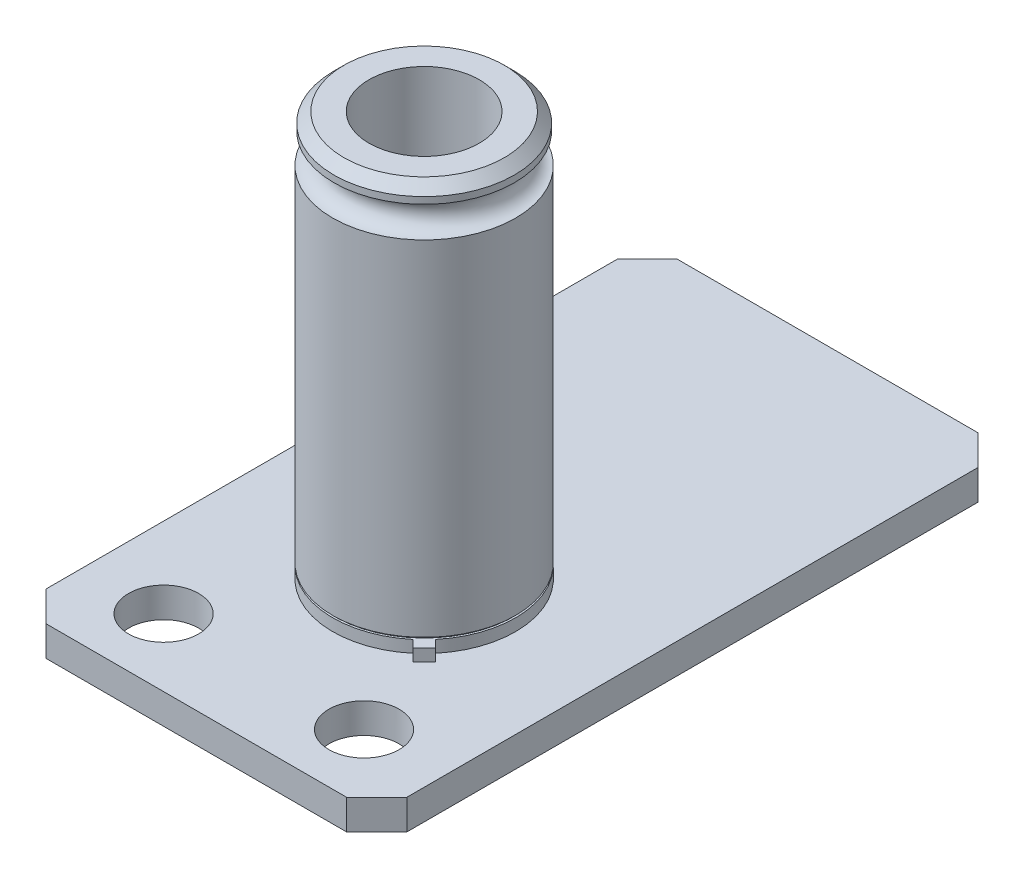
ISO-10303-21;
HEADER;
FILE_DESCRIPTION(('STEP AP214'),'2;1');
FILE_NAME('part.step','',(''),(''),'','','');
FILE_SCHEMA(('AUTOMOTIVE_DESIGN { 1 0 10303 214 1 1 1 1 }'));
ENDSEC;
DATA;
#1=APPLICATION_CONTEXT('core data for automotive mechanical design processes');
#2=APPLICATION_PROTOCOL_DEFINITION('international standard','automotive_design',2000,#1);
#3=PRODUCT_CONTEXT('',#1,'mechanical');
#4=PRODUCT('Part','Part','',(#3));
#5=PRODUCT_RELATED_PRODUCT_CATEGORY('part','',(#4));
#6=PRODUCT_DEFINITION_FORMATION('','',#4);
#7=PRODUCT_DEFINITION_CONTEXT('part definition',#1,'design');
#8=PRODUCT_DEFINITION('design','',#6,#7);
#9=PRODUCT_DEFINITION_SHAPE('','',#8);
#10=(LENGTH_UNIT() NAMED_UNIT(*) SI_UNIT(.MILLI.,.METRE.));
#11=(NAMED_UNIT(*) PLANE_ANGLE_UNIT() SI_UNIT($,.RADIAN.));
#12=(NAMED_UNIT(*) SI_UNIT($,.STERADIAN.) SOLID_ANGLE_UNIT());
#13=UNCERTAINTY_MEASURE_WITH_UNIT(LENGTH_MEASURE(1.E-05),#10,'distance_accuracy_value','');
#14=(GEOMETRIC_REPRESENTATION_CONTEXT(3) GLOBAL_UNCERTAINTY_ASSIGNED_CONTEXT((#13)) GLOBAL_UNIT_ASSIGNED_CONTEXT((#10,
#11,#12)) REPRESENTATION_CONTEXT('',''));
#15=CARTESIAN_POINT('',(0.,0.,0.));
#16=DIRECTION('',(0.,0.,1.));
#17=DIRECTION('',(1.,0.,0.));
#18=AXIS2_PLACEMENT_3D('',#15,#16,#17);
#19=CARTESIAN_POINT('',(-4.46,0.,0.));
#20=DIRECTION('',(0.,1.,0.));
#21=DIRECTION('',(-1.,0.,0.));
#22=AXIS2_PLACEMENT_3D('',#19,#20,#21);
#23=PLANE('',#22);
#24=CARTESIAN_POINT('',(0.,0.,0.));
#25=DIRECTION('',(0.,1.,0.));
#26=DIRECTION('',(-1.,0.,0.));
#27=AXIS2_PLACEMENT_3D('',#24,#25,#26);
#28=CIRCLE('',#27,4.46);
#29=CARTESIAN_POINT('',(-4.46,0.,0.));
#30=VERTEX_POINT('',#29);
#31=EDGE_CURVE('E240',#30,#30,#28,.T.);
#32=ORIENTED_EDGE('',*,*,#31,.T.);
#33=EDGE_LOOP('',(#32));
#34=FACE_BOUND('',#33,.T.);
#35=ADVANCED_FACE('F60',(#34),#23,.T.);
#36=CARTESIAN_POINT('',(0.,0.,0.));
#37=DIRECTION('',(0.,1.,0.));
#38=DIRECTION('',(-1.,0.,0.));
#39=AXIS2_PLACEMENT_3D('',#36,#37,#38);
#40=CYLINDRICAL_SURFACE('',#39,4.56);
#41=DIRECTION('',(0.,1.,0.));
#42=VECTOR('',#41,1.);
#43=CARTESIAN_POINT('',(2.92913487150693,0.,3.49482029645618));
#44=LINE('',#43,#42);
#45=CARTESIAN_POINT('',(2.92913487150693,-0.0999999999999991,3.49482029645618));
#46=VERTEX_POINT('',#45);
#47=CARTESIAN_POINT('',(2.92913487150693,-0.699999999999999,3.49482029645618));
#48=VERTEX_POINT('',#47);
#49=EDGE_CURVE('E237',#46,#48,#44,.F.);
#50=ORIENTED_EDGE('',*,*,#49,.F.);
#51=CARTESIAN_POINT('',(0.,-0.0999999999999995,0.));
#52=DIRECTION('',(0.,1.,0.));
#53=DIRECTION('',(-1.,0.,0.));
#54=AXIS2_PLACEMENT_3D('',#51,#52,#53);
#55=CIRCLE('',#54,4.56);
#56=CARTESIAN_POINT('',(3.49482029645617,-0.099999999999999,2.92913487150694));
#57=VERTEX_POINT('',#56);
#58=EDGE_CURVE('E246',#57,#46,#55,.T.);
#59=ORIENTED_EDGE('',*,*,#58,.F.);
#60=DIRECTION('',(0.,1.,0.));
#61=VECTOR('',#60,1.);
#62=CARTESIAN_POINT('',(3.49482029645617,0.,2.92913487150694));
#63=LINE('',#62,#61);
#64=CARTESIAN_POINT('',(3.49482029645617,-0.699999999999999,2.92913487150694));
#65=VERTEX_POINT('',#64);
#66=EDGE_CURVE('E234',#65,#57,#63,.T.);
#67=ORIENTED_EDGE('',*,*,#66,.F.);
#68=CARTESIAN_POINT('',(0.,-0.699999999999999,0.));
#69=DIRECTION('',(0.,1.,0.));
#70=DIRECTION('',(-1.,0.,0.));
#71=AXIS2_PLACEMENT_3D('',#68,#69,#70);
#72=CIRCLE('',#71,4.56);
#73=EDGE_CURVE('E249',#65,#48,#72,.T.);
#74=ORIENTED_EDGE('',*,*,#73,.T.);
#75=EDGE_LOOP('',(#50,#59,#67,#74));
#76=FACE_BOUND('',#75,.T.);
#77=ADVANCED_FACE('F358',(#76),#40,.T.);
#78=CARTESIAN_POINT('',(-4.56,-0.1,0.));
#79=DIRECTION('',(0.,1.,0.));
#80=DIRECTION('',(-1.,0.,0.));
#81=AXIS2_PLACEMENT_3D('',#78,#79,#80);
#82=PLANE('',#81);
#83=ORIENTED_EDGE('',*,*,#58,.T.);
#84=DIRECTION('',(-0.707106781186546,0.,-0.707106781186549));
#85=VECTOR('',#84,1.);
#86=CARTESIAN_POINT('',(-0.28284271247462,-0.0999999999999994,0.282842712474618));
#87=LINE('',#86,#85);
#88=CARTESIAN_POINT('',(3.2951176003293,-0.099999999999999,3.86080302527856));
#89=VERTEX_POINT('',#88);
#90=EDGE_CURVE('E219',#89,#46,#87,.T.);
#91=ORIENTED_EDGE('',*,*,#90,.F.);
#92=DIRECTION('',(-0.70710678118655,0.,0.707106781186545));
#93=VECTOR('',#92,1.);
#94=CARTESIAN_POINT('',(3.86080302527854,-0.0999999999999994,3.29511760032932));
#95=LINE('',#94,#93);
#96=CARTESIAN_POINT('',(3.86080302527854,-0.099999999999999,3.29511760032932));
#97=VERTEX_POINT('',#96);
#98=EDGE_CURVE('E225',#97,#89,#95,.T.);
#99=ORIENTED_EDGE('',*,*,#98,.F.);
#100=DIRECTION('',(0.707106781186546,0.,0.707106781186549));
#101=VECTOR('',#100,1.);
#102=CARTESIAN_POINT('',(0.28284271247462,-0.0999999999999994,-0.282842712474618));
#103=LINE('',#102,#101);
#104=EDGE_CURVE('E224',#57,#97,#103,.T.);
#105=ORIENTED_EDGE('',*,*,#104,.F.);
#106=EDGE_LOOP('',(#83,#91,#99,#105));
#107=FACE_BOUND('',#106,.T.);
#108=CARTESIAN_POINT('',(0.,-0.0999999999999995,0.));
#109=DIRECTION('',(0.,1.,0.));
#110=DIRECTION('',(-1.,0.,0.));
#111=AXIS2_PLACEMENT_3D('',#108,#109,#110);
#112=CIRCLE('',#111,4.46);
#113=CARTESIAN_POINT('',(-4.46,-0.1,0.));
#114=VERTEX_POINT('',#113);
#115=EDGE_CURVE('E243',#114,#114,#112,.T.);
#116=ORIENTED_EDGE('',*,*,#115,.F.);
#117=EDGE_LOOP('',(#116));
#118=FACE_BOUND('',#117,.T.);
#119=ADVANCED_FACE('F364',(#107,#118),#82,.T.);
#120=CARTESIAN_POINT('',(0.,0.,0.));
#121=DIRECTION('',(0.,1.,0.));
#122=DIRECTION('',(-1.,0.,0.));
#123=AXIS2_PLACEMENT_3D('',#120,#121,#122);
#124=CYLINDRICAL_SURFACE('',#123,4.46);
#125=ORIENTED_EDGE('',*,*,#115,.T.);
#126=EDGE_LOOP('',(#125));
#127=FACE_BOUND('',#126,.T.);
#128=ORIENTED_EDGE('',*,*,#31,.F.);
#129=EDGE_LOOP('',(#128));
#130=FACE_BOUND('',#129,.T.);
#131=ADVANCED_FACE('F368',(#127,#130),#124,.T.);
#132=CARTESIAN_POINT('',(-0.28284271247462,5.76,0.282842712474618));
#133=DIRECTION('',(-0.707106781186549,0.,0.707106781186546));
#134=DIRECTION('',(0.707106781186546,0.,0.707106781186549));
#135=AXIS2_PLACEMENT_3D('',#132,#133,#134);
#136=PLANE('',#135);
#137=ORIENTED_EDGE('',*,*,#90,.T.);
#138=ORIENTED_EDGE('',*,*,#49,.T.);
#139=DIRECTION('',(-0.707106781186546,0.,-0.707106781186549));
#140=VECTOR('',#139,1.);
#141=CARTESIAN_POINT('',(-0.282842712474619,-0.699999999999999,0.282842712474618));
#142=LINE('',#141,#140);
#143=CARTESIAN_POINT('',(3.2951176003293,-0.699999999999999,3.86080302527856));
#144=VERTEX_POINT('',#143);
#145=EDGE_CURVE('E215',#144,#48,#142,.T.);
#146=ORIENTED_EDGE('',*,*,#145,.F.);
#147=DIRECTION('',(0.,-1.,0.));
#148=VECTOR('',#147,1.);
#149=CARTESIAN_POINT('',(3.2951176003293,5.76,3.86080302527856));
#150=LINE('',#149,#148);
#151=EDGE_CURVE('E228',#89,#144,#150,.T.);
#152=ORIENTED_EDGE('',*,*,#151,.F.);
#153=EDGE_LOOP('',(#137,#138,#146,#152));
#154=FACE_BOUND('',#153,.T.);
#155=ADVANCED_FACE('F370',(#154),#136,.T.);
#156=CARTESIAN_POINT('',(0.282842712474619,5.76,-0.282842712474618));
#157=DIRECTION('',(0.707106781186549,0.,-0.707106781186546));
#158=DIRECTION('',(-0.707106781186546,0.,-0.707106781186549));
#159=AXIS2_PLACEMENT_3D('',#156,#157,#158);
#160=PLANE('',#159);
#161=DIRECTION('',(0.707106781186546,0.,0.707106781186549));
#162=VECTOR('',#161,1.);
#163=CARTESIAN_POINT('',(0.28284271247462,-0.699999999999999,-0.282842712474618));
#164=LINE('',#163,#162);
#165=CARTESIAN_POINT('',(3.86080302527854,-0.699999999999999,3.29511760032932));
#166=VERTEX_POINT('',#165);
#167=EDGE_CURVE('E216',#65,#166,#164,.T.);
#168=ORIENTED_EDGE('',*,*,#167,.F.);
#169=ORIENTED_EDGE('',*,*,#66,.T.);
#170=ORIENTED_EDGE('',*,*,#104,.T.);
#171=DIRECTION('',(0.,-1.,0.));
#172=VECTOR('',#171,1.);
#173=CARTESIAN_POINT('',(3.86080302527854,5.76,3.29511760032932));
#174=LINE('',#173,#172);
#175=EDGE_CURVE('E229',#97,#166,#174,.T.);
#176=ORIENTED_EDGE('',*,*,#175,.T.);
#177=EDGE_LOOP('',(#168,#169,#170,#176));
#178=FACE_BOUND('',#177,.T.);
#179=ADVANCED_FACE('F378',(#178),#160,.T.);
#180=CARTESIAN_POINT('',(3.86080302527854,5.76,3.29511760032932));
#181=DIRECTION('',(0.707106781186545,0.,0.70710678118655));
#182=DIRECTION('',(0.70710678118655,0.,-0.707106781186545));
#183=AXIS2_PLACEMENT_3D('',#180,#181,#182);
#184=PLANE('',#183);
#185=ORIENTED_EDGE('',*,*,#175,.F.);
#186=ORIENTED_EDGE('',*,*,#98,.T.);
#187=ORIENTED_EDGE('',*,*,#151,.T.);
#188=DIRECTION('',(-0.70710678118655,0.,0.707106781186545));
#189=VECTOR('',#188,1.);
#190=CARTESIAN_POINT('',(3.86080302527854,-0.699999999999999,3.29511760032932));
#191=LINE('',#190,#189);
#192=EDGE_CURVE('E212',#166,#144,#191,.T.);
#193=ORIENTED_EDGE('',*,*,#192,.F.);
#194=EDGE_LOOP('',(#185,#186,#187,#193));
#195=FACE_BOUND('',#194,.T.);
#196=ADVANCED_FACE('F386',(#195),#184,.T.);
#197=CARTESIAN_POINT('',(9.,-2.2,11.3671159111135));
#198=DIRECTION('',(0.,0.,-1.));
#199=DIRECTION('',(-1.,0.,0.));
#200=AXIS2_PLACEMENT_3D('',#197,#198,#199);
#201=PLANE('',#200);
#202=DIRECTION('',(-1.,0.,0.));
#203=VECTOR('',#202,1.);
#204=CARTESIAN_POINT('',(9.,-2.2,11.3671159111135));
#205=LINE('',#204,#203);
#206=CARTESIAN_POINT('',(7.50000000000001,-2.2,11.3671159111135));
#207=VERTEX_POINT('',#206);
#208=CARTESIAN_POINT('',(-7.5,-2.2,11.3671159111135));
#209=VERTEX_POINT('',#208);
#210=EDGE_CURVE('E187',#207,#209,#205,.T.);
#211=ORIENTED_EDGE('',*,*,#210,.F.);
#212=DIRECTION('',(0.,1.,0.));
#213=VECTOR('',#212,1.);
#214=CARTESIAN_POINT('',(7.50000000000001,-14.2,11.3671159111135));
#215=LINE('',#214,#213);
#216=CARTESIAN_POINT('',(7.50000000000001,-0.699999999999998,11.3671159111135));
#217=VERTEX_POINT('',#216);
#218=EDGE_CURVE('E74',#207,#217,#215,.T.);
#219=ORIENTED_EDGE('',*,*,#218,.T.);
#220=DIRECTION('',(-1.,0.,0.));
#221=VECTOR('',#220,1.);
#222=CARTESIAN_POINT('',(9.,-0.699999999999998,11.3671159111135));
#223=LINE('',#222,#221);
#224=CARTESIAN_POINT('',(-7.5,-0.7,11.3671159111135));
#225=VERTEX_POINT('',#224);
#226=EDGE_CURVE('E163',#217,#225,#223,.T.);
#227=ORIENTED_EDGE('',*,*,#226,.T.);
#228=DIRECTION('',(0.,1.,0.));
#229=VECTOR('',#228,1.);
#230=CARTESIAN_POINT('',(-7.5,-14.2,11.3671159111135));
#231=LINE('',#230,#229);
#232=EDGE_CURVE('E322',#209,#225,#231,.T.);
#233=ORIENTED_EDGE('',*,*,#232,.F.);
#234=EDGE_LOOP('',(#211,#219,#227,#233));
#235=FACE_BOUND('',#234,.T.);
#236=ADVANCED_FACE('F338',(#235),#201,.F.);
#237=CARTESIAN_POINT('',(9.,-2.2,-11.3671159111135));
#238=DIRECTION('',(-1.,0.,0.));
#239=DIRECTION('',(0.,0.,1.));
#240=AXIS2_PLACEMENT_3D('',#237,#238,#239);
#241=PLANE('',#240);
#242=DIRECTION('',(0.,0.,1.));
#243=VECTOR('',#242,1.);
#244=CARTESIAN_POINT('',(9.,-0.699999999999998,-11.3671159111135));
#245=LINE('',#244,#243);
#246=CARTESIAN_POINT('',(9.00000000000001,-0.699999999999998,-18.6328840888865));
#247=VERTEX_POINT('',#246);
#248=CARTESIAN_POINT('',(9.00000000000001,-0.699999999999998,9.86711591111348));
#249=VERTEX_POINT('',#248);
#250=EDGE_CURVE('E161',#247,#249,#245,.T.);
#251=ORIENTED_EDGE('',*,*,#250,.T.);
#252=DIRECTION('',(0.,1.,0.));
#253=VECTOR('',#252,1.);
#254=CARTESIAN_POINT('',(9.00000000000001,-14.2,9.86711591111348));
#255=LINE('',#254,#253);
#256=CARTESIAN_POINT('',(9.00000000000001,-2.2,9.86711591111348));
#257=VERTEX_POINT('',#256);
#258=EDGE_CURVE('E146',#257,#249,#255,.T.);
#259=ORIENTED_EDGE('',*,*,#258,.F.);
#260=DIRECTION('',(0.,0.,1.));
#261=VECTOR('',#260,1.);
#262=CARTESIAN_POINT('',(9.,-2.2,-11.3671159111135));
#263=LINE('',#262,#261);
#264=CARTESIAN_POINT('',(9.,-2.2,-18.6328840888865));
#265=VERTEX_POINT('',#264);
#266=EDGE_CURVE('E296',#265,#257,#263,.T.);
#267=ORIENTED_EDGE('',*,*,#266,.F.);
#268=DIRECTION('',(0.,1.,0.));
#269=VECTOR('',#268,1.);
#270=CARTESIAN_POINT('',(9.00000000000001,-14.2,-18.6328840888865));
#271=LINE('',#270,#269);
#272=EDGE_CURVE('E82',#265,#247,#271,.T.);
#273=ORIENTED_EDGE('',*,*,#272,.T.);
#274=EDGE_LOOP('',(#251,#259,#267,#273));
#275=FACE_BOUND('',#274,.T.);
#276=ADVANCED_FACE('F165',(#275),#241,.F.);
#277=CARTESIAN_POINT('',(-9.,-2.2,-20.1328840888865));
#278=DIRECTION('',(0.,0.,1.));
#279=DIRECTION('',(1.,0.,0.));
#280=AXIS2_PLACEMENT_3D('',#277,#278,#279);
#281=PLANE('',#280);
#282=DIRECTION('',(1.,0.,0.));
#283=VECTOR('',#282,1.);
#284=CARTESIAN_POINT('',(-9.,-0.7,-20.1328840888865));
#285=LINE('',#284,#283);
#286=CARTESIAN_POINT('',(-7.5,-0.7,-20.1328840888865));
#287=VERTEX_POINT('',#286);
#288=CARTESIAN_POINT('',(7.50000000000001,-0.699999999999998,-20.1328840888865));
#289=VERTEX_POINT('',#288);
#290=EDGE_CURVE('E166',#287,#289,#285,.T.);
#291=ORIENTED_EDGE('',*,*,#290,.T.);
#292=DIRECTION('',(0.,1.,0.));
#293=VECTOR('',#292,1.);
#294=CARTESIAN_POINT('',(7.50000000000001,-14.2,-20.1328840888865));
#295=LINE('',#294,#293);
#296=CARTESIAN_POINT('',(7.50000000000001,-2.2,-20.1328840888865));
#297=VERTEX_POINT('',#296);
#298=EDGE_CURVE('E281',#297,#289,#295,.T.);
#299=ORIENTED_EDGE('',*,*,#298,.F.);
#300=DIRECTION('',(1.,0.,0.));
#301=VECTOR('',#300,1.);
#302=CARTESIAN_POINT('',(-9.,-2.2,-20.1328840888865));
#303=LINE('',#302,#301);
#304=CARTESIAN_POINT('',(-7.5,-2.2,-20.1328840888865));
#305=VERTEX_POINT('',#304);
#306=EDGE_CURVE('E288',#305,#297,#303,.T.);
#307=ORIENTED_EDGE('',*,*,#306,.F.);
#308=DIRECTION('',(0.,1.,0.));
#309=VECTOR('',#308,1.);
#310=CARTESIAN_POINT('',(-7.5,-14.2,-20.1328840888865));
#311=LINE('',#310,#309);
#312=EDGE_CURVE('E330',#305,#287,#311,.T.);
#313=ORIENTED_EDGE('',*,*,#312,.T.);
#314=EDGE_LOOP('',(#291,#299,#307,#313));
#315=FACE_BOUND('',#314,.T.);
#316=ADVANCED_FACE('F286',(#315),#281,.F.);
#317=CARTESIAN_POINT('',(0.,-0.699999999999999,0.));
#318=DIRECTION('',(0.,-1.,0.));
#319=DIRECTION('',(1.,0.,0.));
#320=AXIS2_PLACEMENT_3D('',#317,#318,#319);
#321=PLANE('',#320);
#322=CARTESIAN_POINT('',(5.,-0.699999999999999,8.));
#323=DIRECTION('',(0.,1.,0.));
#324=DIRECTION('',(-1.,0.,0.));
#325=AXIS2_PLACEMENT_3D('',#322,#323,#324);
#326=CIRCLE('',#325,1.75);
#327=CARTESIAN_POINT('',(3.25,-0.699999999999999,8.));
#328=VERTEX_POINT('',#327);
#329=EDGE_CURVE('E275',#328,#328,#326,.T.);
#330=ORIENTED_EDGE('',*,*,#329,.F.);
#331=EDGE_LOOP('',(#330));
#332=FACE_BOUND('',#331,.T.);
#333=CARTESIAN_POINT('',(-5.,-0.7,8.));
#334=DIRECTION('',(0.,1.,0.));
#335=DIRECTION('',(-1.,0.,0.));
#336=AXIS2_PLACEMENT_3D('',#333,#334,#335);
#337=CIRCLE('',#336,1.75);
#338=CARTESIAN_POINT('',(-6.75,-0.7,8.));
#339=VERTEX_POINT('',#338);
#340=EDGE_CURVE('E271',#339,#339,#337,.T.);
#341=ORIENTED_EDGE('',*,*,#340,.F.);
#342=EDGE_LOOP('',(#341));
#343=FACE_BOUND('',#342,.T.);
#344=ORIENTED_EDGE('',*,*,#226,.F.);
#345=DIRECTION('',(-0.707106781186548,0.,0.707106781186548));
#346=VECTOR('',#345,1.);
#347=CARTESIAN_POINT('',(9.00000000000001,-0.699999999999998,9.86711591111348));
#348=LINE('',#347,#346);
#349=EDGE_CURVE('E149',#249,#217,#348,.T.);
#350=ORIENTED_EDGE('',*,*,#349,.F.);
#351=ORIENTED_EDGE('',*,*,#250,.F.);
#352=DIRECTION('',(0.707106781186546,0.,0.707106781186549));
#353=VECTOR('',#352,1.);
#354=CARTESIAN_POINT('',(9.00000000000001,-0.699999999999998,-18.6328840888865));
#355=LINE('',#354,#353);
#356=EDGE_CURVE('E290',#289,#247,#355,.T.);
#357=ORIENTED_EDGE('',*,*,#356,.F.);
#358=ORIENTED_EDGE('',*,*,#290,.F.);
#359=DIRECTION('',(0.707106781186548,0.,-0.707106781186547));
#360=VECTOR('',#359,1.);
#361=CARTESIAN_POINT('',(-9.,-0.7,-18.6328840888865));
#362=LINE('',#361,#360);
#363=CARTESIAN_POINT('',(-9.,-0.7,-18.6328840888865));
#364=VERTEX_POINT('',#363);
#365=EDGE_CURVE('E331',#364,#287,#362,.T.);
#366=ORIENTED_EDGE('',*,*,#365,.F.);
#367=DIRECTION('',(0.,0.,-1.));
#368=VECTOR('',#367,1.);
#369=CARTESIAN_POINT('',(-9.,-0.7,-14.7227108509228));
#370=LINE('',#369,#368);
#371=CARTESIAN_POINT('',(-9.,-0.7,9.86711591111348));
#372=VERTEX_POINT('',#371);
#373=EDGE_CURVE('E171',#372,#364,#370,.T.);
#374=ORIENTED_EDGE('',*,*,#373,.F.);
#375=DIRECTION('',(-0.707106781186548,0.,-0.707106781186548));
#376=VECTOR('',#375,1.);
#377=CARTESIAN_POINT('',(-9.,-0.7,9.86711591111348));
#378=LINE('',#377,#376);
#379=EDGE_CURVE('E325',#225,#372,#378,.T.);
#380=ORIENTED_EDGE('',*,*,#379,.F.);
#381=EDGE_LOOP('',(#344,#350,#351,#357,#358,#366,#374,#380));
#382=FACE_BOUND('',#381,.T.);
#383=ORIENTED_EDGE('',*,*,#73,.F.);
#384=ORIENTED_EDGE('',*,*,#167,.T.);
#385=ORIENTED_EDGE('',*,*,#192,.T.);
#386=ORIENTED_EDGE('',*,*,#145,.T.);
#387=EDGE_LOOP('',(#383,#384,#385,#386));
#388=FACE_BOUND('',#387,.T.);
#389=ADVANCED_FACE('F158',(#332,#343,#382,#388),#321,.F.);
#390=CARTESIAN_POINT('',(-9.,-2.2,-14.7227108509228));
#391=DIRECTION('',(1.,0.,0.));
#392=DIRECTION('',(0.,0.,-1.));
#393=AXIS2_PLACEMENT_3D('',#390,#391,#392);
#394=PLANE('',#393);
#395=ORIENTED_EDGE('',*,*,#373,.T.);
#396=DIRECTION('',(0.,1.,0.));
#397=VECTOR('',#396,1.);
#398=CARTESIAN_POINT('',(-9.,-14.2,-18.6328840888865));
#399=LINE('',#398,#397);
#400=CARTESIAN_POINT('',(-9.,-2.2,-18.6328840888865));
#401=VERTEX_POINT('',#400);
#402=EDGE_CURVE('E328',#401,#364,#399,.T.);
#403=ORIENTED_EDGE('',*,*,#402,.F.);
#404=DIRECTION('',(0.,0.,-1.));
#405=VECTOR('',#404,1.);
#406=CARTESIAN_POINT('',(-9.,-2.2,-14.7227108509228));
#407=LINE('',#406,#405);
#408=CARTESIAN_POINT('',(-9.00000000000001,-2.2,9.86711591111347));
#409=VERTEX_POINT('',#408);
#410=EDGE_CURVE('E168',#409,#401,#407,.T.);
#411=ORIENTED_EDGE('',*,*,#410,.F.);
#412=DIRECTION('',(0.,1.,0.));
#413=VECTOR('',#412,1.);
#414=CARTESIAN_POINT('',(-9.,-14.2,9.86711591111348));
#415=LINE('',#414,#413);
#416=EDGE_CURVE('E321',#409,#372,#415,.T.);
#417=ORIENTED_EDGE('',*,*,#416,.T.);
#418=EDGE_LOOP('',(#395,#403,#411,#417));
#419=FACE_BOUND('',#418,.T.);
#420=ADVANCED_FACE('F344',(#419),#394,.F.);
#421=CARTESIAN_POINT('',(0.,-2.2,0.));
#422=DIRECTION('',(0.,-1.,0.));
#423=DIRECTION('',(1.,0.,0.));
#424=AXIS2_PLACEMENT_3D('',#421,#422,#423);
#425=PLANE('',#424);
#426=DIRECTION('',(0.707106781186548,0.,-0.707106781186548));
#427=VECTOR('',#426,1.);
#428=CARTESIAN_POINT('',(9.43355795555674,-2.2,9.43355795555674));
#429=LINE('',#428,#427);
#430=EDGE_CURVE('E14',#207,#257,#429,.T.);
#431=ORIENTED_EDGE('',*,*,#430,.F.);
#432=ORIENTED_EDGE('',*,*,#210,.T.);
#433=DIRECTION('',(0.707106781186548,0.,0.707106781186548));
#434=VECTOR('',#433,1.);
#435=CARTESIAN_POINT('',(-9.43355795555674,-2.2,9.43355795555674));
#436=LINE('',#435,#434);
#437=EDGE_CURVE('E182',#409,#209,#436,.T.);
#438=ORIENTED_EDGE('',*,*,#437,.F.);
#439=ORIENTED_EDGE('',*,*,#410,.T.);
#440=DIRECTION('',(-0.707106781186548,0.,0.707106781186547));
#441=VECTOR('',#440,1.);
#442=CARTESIAN_POINT('',(-13.8164420444433,-2.2,-13.8164420444433));
#443=LINE('',#442,#441);
#444=EDGE_CURVE('E278',#305,#401,#443,.T.);
#445=ORIENTED_EDGE('',*,*,#444,.F.);
#446=ORIENTED_EDGE('',*,*,#306,.T.);
#447=DIRECTION('',(-0.707106781186546,0.,-0.707106781186549));
#448=VECTOR('',#447,1.);
#449=CARTESIAN_POINT('',(13.8164420444433,-2.2,-13.8164420444432));
#450=LINE('',#449,#448);
#451=EDGE_CURVE('E68',#265,#297,#450,.T.);
#452=ORIENTED_EDGE('',*,*,#451,.F.);
#453=ORIENTED_EDGE('',*,*,#266,.T.);
#454=EDGE_LOOP('',(#431,#432,#438,#439,#445,#446,#452,#453));
#455=FACE_BOUND('',#454,.T.);
#456=CARTESIAN_POINT('',(5.,-2.2,8.));
#457=DIRECTION('',(0.,-1.,0.));
#458=DIRECTION('',(1.,0.,0.));
#459=AXIS2_PLACEMENT_3D('',#456,#457,#458);
#460=CIRCLE('',#459,1.75);
#461=CARTESIAN_POINT('',(6.75,-2.2,8.));
#462=VERTEX_POINT('',#461);
#463=EDGE_CURVE('E272',#462,#462,#460,.T.);
#464=ORIENTED_EDGE('',*,*,#463,.F.);
#465=EDGE_LOOP('',(#464));
#466=FACE_BOUND('',#465,.T.);
#467=CARTESIAN_POINT('',(-5.,-2.2,8.));
#468=DIRECTION('',(0.,-1.,0.));
#469=DIRECTION('',(1.,0.,0.));
#470=AXIS2_PLACEMENT_3D('',#467,#468,#469);
#471=CIRCLE('',#470,1.75);
#472=CARTESIAN_POINT('',(-3.25,-2.2,8.));
#473=VERTEX_POINT('',#472);
#474=EDGE_CURVE('E268',#473,#473,#471,.T.);
#475=ORIENTED_EDGE('',*,*,#474,.F.);
#476=EDGE_LOOP('',(#475));
#477=FACE_BOUND('',#476,.T.);
#478=CARTESIAN_POINT('',(0.,-2.2,2.54));
#479=DIRECTION('',(0.,-1.,0.));
#480=DIRECTION('',(1.,0.,0.));
#481=AXIS2_PLACEMENT_3D('',#478,#479,#480);
#482=CIRCLE('',#481,0.225);
#483=CARTESIAN_POINT('',(0.225,-2.2,2.54));
#484=VERTEX_POINT('',#483);
#485=EDGE_CURVE('E200',#484,#484,#482,.T.);
#486=ORIENTED_EDGE('',*,*,#485,.F.);
#487=EDGE_LOOP('',(#486));
#488=FACE_BOUND('',#487,.T.);
#489=CARTESIAN_POINT('',(2.54,-2.2,0.));
#490=DIRECTION('',(0.,-1.,0.));
#491=DIRECTION('',(1.,0.,0.));
#492=AXIS2_PLACEMENT_3D('',#489,#490,#491);
#493=CIRCLE('',#492,0.225);
#494=CARTESIAN_POINT('',(2.765,-2.2,0.));
#495=VERTEX_POINT('',#494);
#496=EDGE_CURVE('E197',#495,#495,#493,.T.);
#497=ORIENTED_EDGE('',*,*,#496,.F.);
#498=EDGE_LOOP('',(#497));
#499=FACE_BOUND('',#498,.T.);
#500=CARTESIAN_POINT('',(0.,-2.2,-2.54));
#501=DIRECTION('',(0.,-1.,0.));
#502=DIRECTION('',(1.,0.,0.));
#503=AXIS2_PLACEMENT_3D('',#500,#501,#502);
#504=CIRCLE('',#503,0.225);
#505=CARTESIAN_POINT('',(0.225,-2.2,-2.54));
#506=VERTEX_POINT('',#505);
#507=EDGE_CURVE('E194',#506,#506,#504,.T.);
#508=ORIENTED_EDGE('',*,*,#507,.F.);
#509=EDGE_LOOP('',(#508));
#510=FACE_BOUND('',#509,.T.);
#511=CARTESIAN_POINT('',(-2.54,-2.2,0.));
#512=DIRECTION('',(0.,-1.,0.));
#513=DIRECTION('',(1.,0.,0.));
#514=AXIS2_PLACEMENT_3D('',#511,#512,#513);
#515=CIRCLE('',#514,0.225);
#516=CARTESIAN_POINT('',(-2.315,-2.2,0.));
#517=VERTEX_POINT('',#516);
#518=EDGE_CURVE('E193',#517,#517,#515,.T.);
#519=ORIENTED_EDGE('',*,*,#518,.F.);
#520=EDGE_LOOP('',(#519));
#521=FACE_BOUND('',#520,.T.);
#522=ADVANCED_FACE('F293',(#455,#466,#477,#488,#499,#510,#521),#425,.T.);
#523=CARTESIAN_POINT('',(0.,-13.1,-2.54));
#524=DIRECTION('',(0.,1.,0.));
#525=DIRECTION('',(-1.,0.,0.));
#526=AXIS2_PLACEMENT_3D('',#523,#524,#525);
#527=CYLINDRICAL_SURFACE('',#526,0.225);
#528=CARTESIAN_POINT('',(0.,-2.43755455334988,-2.54));
#529=DIRECTION('',(0.,1.,0.));
#530=DIRECTION('',(-1.,0.,0.));
#531=AXIS2_PLACEMENT_3D('',#528,#529,#530);
#532=CIRCLE('',#531,0.225);
#533=CARTESIAN_POINT('',(-0.225,-2.43755455334988,-2.54));
#534=VERTEX_POINT('',#533);
#535=EDGE_CURVE('E303',#534,#534,#532,.T.);
#536=ORIENTED_EDGE('',*,*,#535,.T.);
#537=EDGE_LOOP('',(#536));
#538=FACE_BOUND('',#537,.T.);
#539=ORIENTED_EDGE('',*,*,#507,.T.);
#540=EDGE_LOOP('',(#539));
#541=FACE_BOUND('',#540,.T.);
#542=ADVANCED_FACE('F434',(#538,#541),#527,.T.);
#543=CARTESIAN_POINT('',(2.54,-13.1,0.));
#544=DIRECTION('',(0.,1.,0.));
#545=DIRECTION('',(-1.,0.,0.));
#546=AXIS2_PLACEMENT_3D('',#543,#544,#545);
#547=CYLINDRICAL_SURFACE('',#546,0.225);
#548=CARTESIAN_POINT('',(2.54,-2.43755455334988,0.));
#549=DIRECTION('',(0.,1.,0.));
#550=DIRECTION('',(-1.,0.,0.));
#551=AXIS2_PLACEMENT_3D('',#548,#549,#550);
#552=CIRCLE('',#551,0.225);
#553=CARTESIAN_POINT('',(2.315,-2.43755455334988,0.));
#554=VERTEX_POINT('',#553);
#555=EDGE_CURVE('E309',#554,#554,#552,.T.);
#556=ORIENTED_EDGE('',*,*,#555,.T.);
#557=EDGE_LOOP('',(#556));
#558=FACE_BOUND('',#557,.T.);
#559=ORIENTED_EDGE('',*,*,#496,.T.);
#560=EDGE_LOOP('',(#559));
#561=FACE_BOUND('',#560,.T.);
#562=ADVANCED_FACE('F430',(#558,#561),#547,.T.);
#563=CARTESIAN_POINT('',(0.,-13.1,2.54));
#564=DIRECTION('',(0.,1.,0.));
#565=DIRECTION('',(-1.,0.,0.));
#566=AXIS2_PLACEMENT_3D('',#563,#564,#565);
#567=CYLINDRICAL_SURFACE('',#566,0.225);
#568=CARTESIAN_POINT('',(0.,-2.43755455334988,2.54));
#569=DIRECTION('',(0.,1.,0.));
#570=DIRECTION('',(-1.,0.,0.));
#571=AXIS2_PLACEMENT_3D('',#568,#569,#570);
#572=CIRCLE('',#571,0.225);
#573=CARTESIAN_POINT('',(-0.225,-2.43755455334988,2.54));
#574=VERTEX_POINT('',#573);
#575=EDGE_CURVE('E267',#574,#574,#572,.T.);
#576=ORIENTED_EDGE('',*,*,#575,.T.);
#577=EDGE_LOOP('',(#576));
#578=FACE_BOUND('',#577,.T.);
#579=ORIENTED_EDGE('',*,*,#485,.T.);
#580=EDGE_LOOP('',(#579));
#581=FACE_BOUND('',#580,.T.);
#582=ADVANCED_FACE('F426',(#578,#581),#567,.T.);
#583=CARTESIAN_POINT('',(-2.54,-13.1,0.));
#584=DIRECTION('',(0.,1.,0.));
#585=DIRECTION('',(-1.,0.,0.));
#586=AXIS2_PLACEMENT_3D('',#583,#584,#585);
#587=CYLINDRICAL_SURFACE('',#586,0.225);
#588=CARTESIAN_POINT('',(-2.54,-2.43755455334988,0.));
#589=DIRECTION('',(0.,1.,0.));
#590=DIRECTION('',(-1.,0.,0.));
#591=AXIS2_PLACEMENT_3D('',#588,#589,#590);
#592=CIRCLE('',#591,0.225);
#593=CARTESIAN_POINT('',(-2.765,-2.43755455334988,0.));
#594=VERTEX_POINT('',#593);
#595=EDGE_CURVE('E264',#594,#594,#592,.T.);
#596=ORIENTED_EDGE('',*,*,#595,.T.);
#597=EDGE_LOOP('',(#596));
#598=FACE_BOUND('',#597,.T.);
#599=ORIENTED_EDGE('',*,*,#518,.T.);
#600=EDGE_LOOP('',(#599));
#601=FACE_BOUND('',#600,.T.);
#602=ADVANCED_FACE('F429',(#598,#601),#587,.T.);
#603=CARTESIAN_POINT('',(4.5,-2.43755455334988,-2.93327593557546));
#604=DIRECTION('',(0.,1.,0.));
#605=DIRECTION('',(-1.,0.,0.));
#606=AXIS2_PLACEMENT_3D('',#603,#604,#605);
#607=PLANE('',#606);
#608=ORIENTED_EDGE('',*,*,#595,.F.);
#609=EDGE_LOOP('',(#608));
#610=FACE_BOUND('',#609,.T.);
#611=ADVANCED_FACE('F440',(#610),#607,.F.);
#612=ORIENTED_EDGE('',*,*,#575,.F.);
#613=EDGE_LOOP('',(#612));
#614=FACE_BOUND('',#613,.T.);
#615=ADVANCED_FACE('F553',(#614),#607,.F.);
#616=ORIENTED_EDGE('',*,*,#555,.F.);
#617=EDGE_LOOP('',(#616));
#618=FACE_BOUND('',#617,.T.);
#619=ADVANCED_FACE('F459',(#618),#607,.F.);
#620=ORIENTED_EDGE('',*,*,#535,.F.);
#621=EDGE_LOOP('',(#620));
#622=FACE_BOUND('',#621,.T.);
#623=ADVANCED_FACE('F455',(#622),#607,.F.);
#624=CARTESIAN_POINT('',(-5.,-14.2,8.));
#625=DIRECTION('',(0.,1.,0.));
#626=DIRECTION('',(-1.,0.,0.));
#627=AXIS2_PLACEMENT_3D('',#624,#625,#626);
#628=CYLINDRICAL_SURFACE('',#627,1.75);
#629=ORIENTED_EDGE('',*,*,#474,.T.);
#630=EDGE_LOOP('',(#629));
#631=FACE_BOUND('',#630,.T.);
#632=ORIENTED_EDGE('',*,*,#340,.T.);
#633=EDGE_LOOP('',(#632));
#634=FACE_BOUND('',#633,.T.);
#635=ADVANCED_FACE('F458',(#631,#634),#628,.F.);
#636=CARTESIAN_POINT('',(5.,-14.2,8.));
#637=DIRECTION('',(0.,1.,0.));
#638=DIRECTION('',(-1.,0.,0.));
#639=AXIS2_PLACEMENT_3D('',#636,#637,#638);
#640=CYLINDRICAL_SURFACE('',#639,1.75);
#641=ORIENTED_EDGE('',*,*,#463,.T.);
#642=EDGE_LOOP('',(#641));
#643=FACE_BOUND('',#642,.T.);
#644=ORIENTED_EDGE('',*,*,#329,.T.);
#645=EDGE_LOOP('',(#644));
#646=FACE_BOUND('',#645,.T.);
#647=ADVANCED_FACE('F355',(#643,#646),#640,.F.);
#648=CARTESIAN_POINT('',(-9.,-14.2,9.86711591111348));
#649=DIRECTION('',(0.707106781186547,0.,-0.707106781186547));
#650=DIRECTION('',(-0.707106781186548,0.,-0.707106781186548));
#651=AXIS2_PLACEMENT_3D('',#648,#649,#650);
#652=PLANE('',#651);
#653=ORIENTED_EDGE('',*,*,#437,.T.);
#654=ORIENTED_EDGE('',*,*,#232,.T.);
#655=ORIENTED_EDGE('',*,*,#379,.T.);
#656=ORIENTED_EDGE('',*,*,#416,.F.);
#657=EDGE_LOOP('',(#653,#654,#655,#656));
#658=FACE_BOUND('',#657,.T.);
#659=ADVANCED_FACE('F343',(#658),#652,.F.);
#660=CARTESIAN_POINT('',(-9.,-14.2,-18.6328840888865));
#661=DIRECTION('',(0.707106781186547,0.,0.707106781186548));
#662=DIRECTION('',(0.707106781186548,0.,-0.707106781186547));
#663=AXIS2_PLACEMENT_3D('',#660,#661,#662);
#664=PLANE('',#663);
#665=ORIENTED_EDGE('',*,*,#444,.T.);
#666=ORIENTED_EDGE('',*,*,#402,.T.);
#667=ORIENTED_EDGE('',*,*,#365,.T.);
#668=ORIENTED_EDGE('',*,*,#312,.F.);
#669=EDGE_LOOP('',(#665,#666,#667,#668));
#670=FACE_BOUND('',#669,.T.);
#671=ADVANCED_FACE('F347',(#670),#664,.F.);
#672=CARTESIAN_POINT('',(9.00000000000001,-14.2,-18.6328840888865));
#673=DIRECTION('',(-0.707106781186549,0.,0.707106781186546));
#674=DIRECTION('',(0.707106781186546,0.,0.707106781186549));
#675=AXIS2_PLACEMENT_3D('',#672,#673,#674);
#676=PLANE('',#675);
#677=ORIENTED_EDGE('',*,*,#451,.T.);
#678=ORIENTED_EDGE('',*,*,#298,.T.);
#679=ORIENTED_EDGE('',*,*,#356,.T.);
#680=ORIENTED_EDGE('',*,*,#272,.F.);
#681=EDGE_LOOP('',(#677,#678,#679,#680));
#682=FACE_BOUND('',#681,.T.);
#683=ADVANCED_FACE('F280',(#682),#676,.F.);
#684=CARTESIAN_POINT('',(9.00000000000001,-14.2,9.86711591111348));
#685=DIRECTION('',(-0.707106781186547,0.,-0.707106781186547));
#686=DIRECTION('',(-0.707106781186548,0.,0.707106781186548));
#687=AXIS2_PLACEMENT_3D('',#684,#685,#686);
#688=PLANE('',#687);
#689=ORIENTED_EDGE('',*,*,#430,.T.);
#690=ORIENTED_EDGE('',*,*,#258,.T.);
#691=ORIENTED_EDGE('',*,*,#349,.T.);
#692=ORIENTED_EDGE('',*,*,#218,.F.);
#693=EDGE_LOOP('',(#689,#690,#691,#692));
#694=FACE_BOUND('',#693,.T.);
#695=ADVANCED_FACE('F148',(#694),#688,.F.);
#696=CLOSED_SHELL('',(#35,#77,#119,#131,#155,#179,#196,#236,#276,#316,#389,#420,#522,#542,#562,
#582,#602,#611,#615,#619,#623,#635,#647,#659,#671,#683,#695));
#697=CARTESIAN_POINT('',(0.,-0.699999999999999,-2.54));
#698=DIRECTION('',(0.,-1.,0.));
#699=DIRECTION('',(1.,0.,0.));
#700=AXIS2_PLACEMENT_3D('',#697,#698,#699);
#701=CIRCLE('',#700,0.8);
#702=CARTESIAN_POINT('',(0.8,-0.699999999999999,-2.54));
#703=VERTEX_POINT('',#702);
#704=EDGE_CURVE('E186',#703,#703,#701,.F.);
#705=ORIENTED_EDGE('',*,*,#704,.T.);
#706=EDGE_LOOP('',(#705));
#707=FACE_BOUND('',#706,.T.);
#708=CARTESIAN_POINT('',(0.,-0.699999999999999,-2.54));
#709=DIRECTION('',(0.,-1.,0.));
#710=DIRECTION('',(1.,0.,0.));
#711=AXIS2_PLACEMENT_3D('',#708,#709,#710);
#712=CIRCLE('',#711,0.225);
#713=CARTESIAN_POINT('',(0.225,-0.699999999999999,-2.54));
#714=VERTEX_POINT('',#713);
#715=EDGE_CURVE('E175',#714,#714,#712,.T.);
#716=ORIENTED_EDGE('',*,*,#715,.T.);
#717=EDGE_LOOP('',(#716));
#718=FACE_BOUND('',#717,.T.);
#719=ADVANCED_FACE('F412',(#707,#718),#321,.F.);
#720=CARTESIAN_POINT('',(0.,2.16274169979695,-2.54));
#721=DIRECTION('',(0.,-1.,0.));
#722=DIRECTION('',(1.,0.,0.));
#723=AXIS2_PLACEMENT_3D('',#720,#721,#722);
#724=CYLINDRICAL_SURFACE('',#723,0.8);
#725=ORIENTED_EDGE('',*,*,#704,.F.);
#726=EDGE_LOOP('',(#725));
#727=FACE_BOUND('',#726,.T.);
#728=CARTESIAN_POINT('',(0.,-0.0999999999999994,-2.54));
#729=DIRECTION('',(0.,1.,0.));
#730=DIRECTION('',(-1.,0.,0.));
#731=AXIS2_PLACEMENT_3D('',#728,#729,#730);
#732=CIRCLE('',#731,0.8);
#733=CARTESIAN_POINT('',(-0.8,-0.0999999999999995,-2.54));
#734=VERTEX_POINT('',#733);
#735=EDGE_CURVE('E206',#734,#734,#732,.F.);
#736=ORIENTED_EDGE('',*,*,#735,.F.);
#737=EDGE_LOOP('',(#736));
#738=FACE_BOUND('',#737,.T.);
#739=ADVANCED_FACE('F407',(#727,#738),#724,.F.);
#740=CARTESIAN_POINT('',(-4.56,-0.1,0.));
#741=DIRECTION('',(0.,1.,0.));
#742=DIRECTION('',(-1.,0.,0.));
#743=AXIS2_PLACEMENT_3D('',#740,#741,#742);
#744=PLANE('',#743);
#745=CARTESIAN_POINT('',(0.,-0.0999999999999994,-2.54));
#746=DIRECTION('',(0.,1.,0.));
#747=DIRECTION('',(-1.,0.,0.));
#748=AXIS2_PLACEMENT_3D('',#745,#746,#747);
#749=CIRCLE('',#748,0.225);
#750=CARTESIAN_POINT('',(-0.225,-0.0999999999999994,-2.54));
#751=VERTEX_POINT('',#750);
#752=EDGE_CURVE('E254',#751,#751,#749,.F.);
#753=ORIENTED_EDGE('',*,*,#752,.F.);
#754=EDGE_LOOP('',(#753));
#755=FACE_BOUND('',#754,.T.);
#756=ORIENTED_EDGE('',*,*,#735,.T.);
#757=EDGE_LOOP('',(#756));
#758=FACE_BOUND('',#757,.T.);
#759=ADVANCED_FACE('F403',(#755,#758),#744,.F.);
#760=ORIENTED_EDGE('',*,*,#752,.T.);
#761=EDGE_LOOP('',(#760));
#762=FACE_BOUND('',#761,.T.);
#763=ORIENTED_EDGE('',*,*,#715,.F.);
#764=EDGE_LOOP('',(#763));
#765=FACE_BOUND('',#764,.T.);
#766=ADVANCED_FACE('F406',(#762,#765),#527,.T.);
#767=CLOSED_SHELL('',(#719,#739,#759,#766));
#768=CARTESIAN_POINT('',(-2.54,-0.7,0.));
#769=DIRECTION('',(0.,-1.,0.));
#770=DIRECTION('',(1.,0.,0.));
#771=AXIS2_PLACEMENT_3D('',#768,#769,#770);
#772=CIRCLE('',#771,0.8);
#773=CARTESIAN_POINT('',(-1.74,-0.7,0.));
#774=VERTEX_POINT('',#773);
#775=EDGE_CURVE('E183',#774,#774,#772,.F.);
#776=ORIENTED_EDGE('',*,*,#775,.T.);
#777=EDGE_LOOP('',(#776));
#778=FACE_BOUND('',#777,.T.);
#779=CARTESIAN_POINT('',(-2.54,-0.699999999999999,0.));
#780=DIRECTION('',(0.,-1.,0.));
#781=DIRECTION('',(1.,0.,0.));
#782=AXIS2_PLACEMENT_3D('',#779,#780,#781);
#783=CIRCLE('',#782,0.225);
#784=CARTESIAN_POINT('',(-2.315,-0.699999999999999,0.));
#785=VERTEX_POINT('',#784);
#786=EDGE_CURVE('E179',#785,#785,#783,.T.);
#787=ORIENTED_EDGE('',*,*,#786,.T.);
#788=EDGE_LOOP('',(#787));
#789=FACE_BOUND('',#788,.T.);
#790=ADVANCED_FACE('F424',(#778,#789),#321,.F.);
#791=CARTESIAN_POINT('',(-2.54,2.16274169979695,0.));
#792=DIRECTION('',(0.,-1.,0.));
#793=DIRECTION('',(1.,0.,0.));
#794=AXIS2_PLACEMENT_3D('',#791,#792,#793);
#795=CYLINDRICAL_SURFACE('',#794,0.8);
#796=ORIENTED_EDGE('',*,*,#775,.F.);
#797=EDGE_LOOP('',(#796));
#798=FACE_BOUND('',#797,.T.);
#799=CARTESIAN_POINT('',(-2.54,-0.0999999999999994,0.));
#800=DIRECTION('',(0.,1.,0.));
#801=DIRECTION('',(-1.,0.,0.));
#802=AXIS2_PLACEMENT_3D('',#799,#800,#801);
#803=CIRCLE('',#802,0.8);
#804=CARTESIAN_POINT('',(-3.34,-0.0999999999999995,0.));
#805=VERTEX_POINT('',#804);
#806=EDGE_CURVE('E203',#805,#805,#803,.F.);
#807=ORIENTED_EDGE('',*,*,#806,.F.);
#808=EDGE_LOOP('',(#807));
#809=FACE_BOUND('',#808,.T.);
#810=ADVANCED_FACE('F418',(#798,#809),#795,.F.);
#811=CARTESIAN_POINT('',(-4.56,-0.1,0.));
#812=DIRECTION('',(0.,1.,0.));
#813=DIRECTION('',(-1.,0.,0.));
#814=AXIS2_PLACEMENT_3D('',#811,#812,#813);
#815=PLANE('',#814);
#816=CARTESIAN_POINT('',(-2.54,-0.0999999999999994,0.));
#817=DIRECTION('',(0.,1.,0.));
#818=DIRECTION('',(-1.,0.,0.));
#819=AXIS2_PLACEMENT_3D('',#816,#817,#818);
#820=CIRCLE('',#819,0.225);
#821=CARTESIAN_POINT('',(-2.765,-0.0999999999999994,0.));
#822=VERTEX_POINT('',#821);
#823=EDGE_CURVE('E257',#822,#822,#820,.F.);
#824=ORIENTED_EDGE('',*,*,#823,.F.);
#825=EDGE_LOOP('',(#824));
#826=FACE_BOUND('',#825,.T.);
#827=ORIENTED_EDGE('',*,*,#806,.T.);
#828=EDGE_LOOP('',(#827));
#829=FACE_BOUND('',#828,.T.);
#830=ADVANCED_FACE('F414',(#826,#829),#815,.F.);
#831=ORIENTED_EDGE('',*,*,#823,.T.);
#832=EDGE_LOOP('',(#831));
#833=FACE_BOUND('',#832,.T.);
#834=ORIENTED_EDGE('',*,*,#786,.F.);
#835=EDGE_LOOP('',(#834));
#836=FACE_BOUND('',#835,.T.);
#837=ADVANCED_FACE('F417',(#833,#836),#587,.T.);
#838=CLOSED_SHELL('',(#790,#810,#830,#837));
#839=CARTESIAN_POINT('',(2.54,-0.699999999999999,0.));
#840=DIRECTION('',(0.,-1.,0.));
#841=DIRECTION('',(1.,0.,0.));
#842=AXIS2_PLACEMENT_3D('',#839,#840,#841);
#843=CIRCLE('',#842,0.8);
#844=CARTESIAN_POINT('',(3.34,-0.699999999999999,0.));
#845=VERTEX_POINT('',#844);
#846=EDGE_CURVE('E190',#845,#845,#843,.F.);
#847=ORIENTED_EDGE('',*,*,#846,.T.);
#848=EDGE_LOOP('',(#847));
#849=FACE_BOUND('',#848,.T.);
#850=CARTESIAN_POINT('',(2.54,-0.699999999999999,0.));
#851=DIRECTION('',(0.,-1.,0.));
#852=DIRECTION('',(1.,0.,0.));
#853=AXIS2_PLACEMENT_3D('',#850,#851,#852);
#854=CIRCLE('',#853,0.225);
#855=CARTESIAN_POINT('',(2.765,-0.699999999999999,0.));
#856=VERTEX_POINT('',#855);
#857=EDGE_CURVE('E178',#856,#856,#854,.T.);
#858=ORIENTED_EDGE('',*,*,#857,.T.);
#859=EDGE_LOOP('',(#858));
#860=FACE_BOUND('',#859,.T.);
#861=ADVANCED_FACE('F401',(#849,#860),#321,.F.);
#862=CARTESIAN_POINT('',(2.54,2.16274169979695,0.));
#863=DIRECTION('',(0.,-1.,0.));
#864=DIRECTION('',(1.,0.,0.));
#865=AXIS2_PLACEMENT_3D('',#862,#863,#864);
#866=CYLINDRICAL_SURFACE('',#865,0.8);
#867=ORIENTED_EDGE('',*,*,#846,.F.);
#868=EDGE_LOOP('',(#867));
#869=FACE_BOUND('',#868,.T.);
#870=CARTESIAN_POINT('',(2.54,-0.099999999999999,0.));
#871=DIRECTION('',(0.,1.,0.));
#872=DIRECTION('',(-1.,0.,0.));
#873=AXIS2_PLACEMENT_3D('',#870,#871,#872);
#874=CIRCLE('',#873,0.8);
#875=CARTESIAN_POINT('',(1.74,-0.0999999999999991,0.));
#876=VERTEX_POINT('',#875);
#877=EDGE_CURVE('E209',#876,#876,#874,.F.);
#878=ORIENTED_EDGE('',*,*,#877,.F.);
#879=EDGE_LOOP('',(#878));
#880=FACE_BOUND('',#879,.T.);
#881=ADVANCED_FACE('F395',(#869,#880),#866,.F.);
#882=CARTESIAN_POINT('',(-4.56,-0.1,0.));
#883=DIRECTION('',(0.,1.,0.));
#884=DIRECTION('',(-1.,0.,0.));
#885=AXIS2_PLACEMENT_3D('',#882,#883,#884);
#886=PLANE('',#885);
#887=CARTESIAN_POINT('',(2.54,-0.0999999999999977,0.));
#888=DIRECTION('',(0.,1.,0.));
#889=DIRECTION('',(-1.,0.,0.));
#890=AXIS2_PLACEMENT_3D('',#887,#888,#889);
#891=CIRCLE('',#890,0.225);
#892=CARTESIAN_POINT('',(2.315,-0.0999999999999977,0.));
#893=VERTEX_POINT('',#892);
#894=EDGE_CURVE('E251',#893,#893,#891,.F.);
#895=ORIENTED_EDGE('',*,*,#894,.F.);
#896=EDGE_LOOP('',(#895));
#897=FACE_BOUND('',#896,.T.);
#898=ORIENTED_EDGE('',*,*,#877,.T.);
#899=EDGE_LOOP('',(#898));
#900=FACE_BOUND('',#899,.T.);
#901=ADVANCED_FACE('F391',(#897,#900),#886,.F.);
#902=ORIENTED_EDGE('',*,*,#894,.T.);
#903=EDGE_LOOP('',(#902));
#904=FACE_BOUND('',#903,.T.);
#905=ORIENTED_EDGE('',*,*,#857,.F.);
#906=EDGE_LOOP('',(#905));
#907=FACE_BOUND('',#906,.T.);
#908=ADVANCED_FACE('F394',(#904,#907),#547,.T.);
#909=CLOSED_SHELL('',(#861,#881,#901,#908));
#910=ORIENTED_CLOSED_SHELL('',*,#767,.T.);
#911=ORIENTED_CLOSED_SHELL('',*,#838,.T.);
#912=ORIENTED_CLOSED_SHELL('',*,#909,.T.);
#913=BREP_WITH_VOIDS('B2',#696,(#910,#911,#912));
#914=CARTESIAN_POINT('',(0.,17.92,0.));
#915=DIRECTION('',(0.,1.,0.));
#916=DIRECTION('',(0.,0.,1.));
#917=AXIS2_PLACEMENT_3D('',#914,#915,#916);
#918=TOROIDAL_SURFACE('',#917,4.56,0.75);
#919=CARTESIAN_POINT('',(0.,18.6675961476626,0.));
#920=DIRECTION('',(0.,-1.,0.));
#921=DIRECTION('',(0.,0.,-1.));
#922=AXIS2_PLACEMENT_3D('',#919,#920,#921);
#923=CIRCLE('',#922,4.5);
#924=CARTESIAN_POINT('',(0.,18.6675961476626,-4.5));
#925=VERTEX_POINT('',#924);
#926=EDGE_CURVE('E809',#925,#925,#923,.T.);
#927=ORIENTED_EDGE('',*,*,#926,.T.);
#928=EDGE_LOOP('',(#927));
#929=FACE_BOUND('',#928,.T.);
#930=CARTESIAN_POINT('',(0.,17.17,0.));
#931=DIRECTION('',(0.,1.,0.));
#932=DIRECTION('',(0.,0.,1.));
#933=AXIS2_PLACEMENT_3D('',#930,#931,#932);
#934=CIRCLE('',#933,4.56);
#935=CARTESIAN_POINT('',(0.,17.17,4.56));
#936=VERTEX_POINT('',#935);
#937=EDGE_CURVE('E806',#936,#936,#934,.F.);
#938=ORIENTED_EDGE('',*,*,#937,.F.);
#939=EDGE_LOOP('',(#938));
#940=FACE_BOUND('',#939,.T.);
#941=ADVANCED_FACE('F791',(#929,#940),#918,.F.);
#942=CARTESIAN_POINT('',(0.,0.,0.));
#943=DIRECTION('',(0.,1.,0.));
#944=DIRECTION('',(0.,0.,1.));
#945=AXIS2_PLACEMENT_3D('',#942,#943,#944);
#946=PLANE('',#945);
#947=CARTESIAN_POINT('',(0.,0.,0.));
#948=DIRECTION('',(0.,1.,0.));
#949=DIRECTION('',(0.,0.,1.));
#950=AXIS2_PLACEMENT_3D('',#947,#948,#949);
#951=CIRCLE('',#950,2.75);
#952=CARTESIAN_POINT('',(0.,0.,2.75));
#953=VERTEX_POINT('',#952);
#954=EDGE_CURVE('E812',#953,#953,#951,.T.);
#955=ORIENTED_EDGE('',*,*,#954,.T.);
#956=EDGE_LOOP('',(#955));
#957=FACE_BOUND('',#956,.T.);
#958=CARTESIAN_POINT('',(0.,0.,0.));
#959=DIRECTION('',(0.,1.,0.));
#960=DIRECTION('',(0.,0.,1.));
#961=AXIS2_PLACEMENT_3D('',#958,#959,#960);
#962=CIRCLE('',#961,4.56);
#963=CARTESIAN_POINT('',(0.,0.,4.56));
#964=VERTEX_POINT('',#963);
#965=EDGE_CURVE('E802',#964,#964,#962,.T.);
#966=ORIENTED_EDGE('',*,*,#965,.F.);
#967=EDGE_LOOP('',(#966));
#968=FACE_BOUND('',#967,.T.);
#969=ADVANCED_FACE('F837',(#957,#968),#946,.F.);
#970=CARTESIAN_POINT('',(0.,19.5,0.));
#971=DIRECTION('',(0.,-1.,0.));
#972=DIRECTION('',(0.,0.,-1.));
#973=AXIS2_PLACEMENT_3D('',#970,#971,#972);
#974=CYLINDRICAL_SURFACE('',#973,4.56);
#975=ORIENTED_EDGE('',*,*,#937,.T.);
#976=EDGE_LOOP('',(#975));
#977=FACE_BOUND('',#976,.T.);
#978=ORIENTED_EDGE('',*,*,#965,.T.);
#979=EDGE_LOOP('',(#978));
#980=FACE_BOUND('',#979,.T.);
#981=ADVANCED_FACE('F832',(#977,#980),#974,.T.);
#982=CARTESIAN_POINT('',(0.,19.5,0.));
#983=DIRECTION('',(0.,1.,0.));
#984=DIRECTION('',(0.,0.,1.));
#985=AXIS2_PLACEMENT_3D('',#982,#983,#984);
#986=CYLINDRICAL_SURFACE('',#985,4.5);
#987=CARTESIAN_POINT('',(0.,19.,0.));
#988=DIRECTION('',(0.,1.,0.));
#989=DIRECTION('',(0.,0.,1.));
#990=AXIS2_PLACEMENT_3D('',#987,#988,#989);
#991=CIRCLE('',#990,4.5);
#992=CARTESIAN_POINT('',(0.,19.,4.5));
#993=VERTEX_POINT('',#992);
#994=EDGE_CURVE('E798',#993,#993,#991,.F.);
#995=ORIENTED_EDGE('',*,*,#994,.T.);
#996=EDGE_LOOP('',(#995));
#997=FACE_BOUND('',#996,.T.);
#998=ORIENTED_EDGE('',*,*,#926,.F.);
#999=EDGE_LOOP('',(#998));
#1000=FACE_BOUND('',#999,.T.);
#1001=ADVANCED_FACE('F825',(#997,#1000),#986,.T.);
#1002=CARTESIAN_POINT('',(0.,19.5,0.));
#1003=DIRECTION('',(0.,1.,0.));
#1004=DIRECTION('',(0.,0.,1.));
#1005=AXIS2_PLACEMENT_3D('',#1002,#1003,#1004);
#1006=PLANE('',#1005);
#1007=CARTESIAN_POINT('',(0.,19.5,0.));
#1008=DIRECTION('',(0.,1.,0.));
#1009=DIRECTION('',(0.,0.,1.));
#1010=AXIS2_PLACEMENT_3D('',#1007,#1008,#1009);
#1011=CIRCLE('',#1010,2.75);
#1012=CARTESIAN_POINT('',(0.,19.5,2.75));
#1013=VERTEX_POINT('',#1012);
#1014=EDGE_CURVE('E817',#1013,#1013,#1011,.T.);
#1015=ORIENTED_EDGE('',*,*,#1014,.F.);
#1016=EDGE_LOOP('',(#1015));
#1017=FACE_BOUND('',#1016,.T.);
#1018=CARTESIAN_POINT('',(0.,19.5,0.));
#1019=DIRECTION('',(0.,1.,0.));
#1020=DIRECTION('',(0.,0.,1.));
#1021=AXIS2_PLACEMENT_3D('',#1018,#1019,#1020);
#1022=CIRCLE('',#1021,4.);
#1023=CARTESIAN_POINT('',(0.,19.5,4.));
#1024=VERTEX_POINT('',#1023);
#1025=EDGE_CURVE('E58',#1024,#1024,#1022,.T.);
#1026=ORIENTED_EDGE('',*,*,#1025,.T.);
#1027=EDGE_LOOP('',(#1026));
#1028=FACE_BOUND('',#1027,.T.);
#1029=ADVANCED_FACE('F823',(#1017,#1028),#1006,.T.);
#1030=CARTESIAN_POINT('',(0.,19.,0.));
#1031=DIRECTION('',(0.,-1.,0.));
#1032=DIRECTION('',(0.,0.,-1.));
#1033=AXIS2_PLACEMENT_3D('',#1030,#1031,#1032);
#1034=CONICAL_SURFACE('',#1033,4.5,0.785398163397453);
#1035=ORIENTED_EDGE('',*,*,#1025,.F.);
#1036=EDGE_LOOP('',(#1035));
#1037=FACE_BOUND('',#1036,.T.);
#1038=ORIENTED_EDGE('',*,*,#994,.F.);
#1039=EDGE_LOOP('',(#1038));
#1040=FACE_BOUND('',#1039,.T.);
#1041=ADVANCED_FACE('F793',(#1037,#1040),#1034,.T.);
#1042=CARTESIAN_POINT('',(0.,19.5,0.));
#1043=DIRECTION('',(0.,1.,0.));
#1044=DIRECTION('',(0.,0.,1.));
#1045=AXIS2_PLACEMENT_3D('',#1042,#1043,#1044);
#1046=CYLINDRICAL_SURFACE('',#1045,2.75);
#1047=ORIENTED_EDGE('',*,*,#954,.F.);
#1048=EDGE_LOOP('',(#1047));
#1049=FACE_BOUND('',#1048,.T.);
#1050=ORIENTED_EDGE('',*,*,#1014,.T.);
#1051=EDGE_LOOP('',(#1050));
#1052=FACE_BOUND('',#1051,.T.);
#1053=ADVANCED_FACE('F821',(#1049,#1052),#1046,.F.);
#1054=CLOSED_SHELL('',(#941,#969,#981,#1001,#1029,#1041,#1053));
#1055=MANIFOLD_SOLID_BREP('B8',#1054);
#1056=ADVANCED_BREP_SHAPE_REPRESENTATION('',(#18,#913,#1055),#14);
#1057=SHAPE_DEFINITION_REPRESENTATION(#9,#1056);
ENDSEC;
END-ISO-10303-21;
